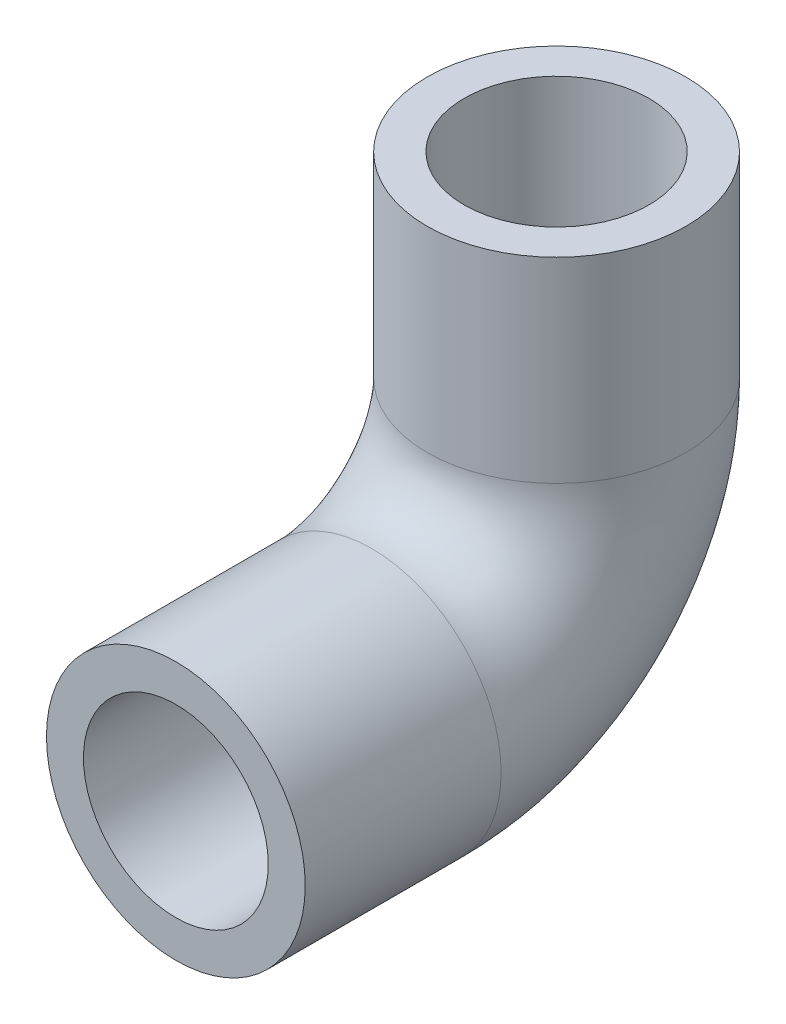
ISO-10303-21;
HEADER;
FILE_DESCRIPTION(('STEP AP214'),'2;1');
FILE_NAME('part.step','',(''),(''),'','','');
FILE_SCHEMA(('AUTOMOTIVE_DESIGN { 1 0 10303 214 1 1 1 1 }'));
ENDSEC;
DATA;
#1=APPLICATION_CONTEXT('core data for automotive mechanical design processes');
#2=APPLICATION_PROTOCOL_DEFINITION('international standard','automotive_design',2000,#1);
#3=PRODUCT_CONTEXT('',#1,'mechanical');
#4=PRODUCT('Part','Part','',(#3));
#5=PRODUCT_RELATED_PRODUCT_CATEGORY('part','',(#4));
#6=PRODUCT_DEFINITION_FORMATION('','',#4);
#7=PRODUCT_DEFINITION_CONTEXT('part definition',#1,'design');
#8=PRODUCT_DEFINITION('design','',#6,#7);
#9=PRODUCT_DEFINITION_SHAPE('','',#8);
#10=(LENGTH_UNIT() NAMED_UNIT(*) SI_UNIT(.MILLI.,.METRE.));
#11=(NAMED_UNIT(*) PLANE_ANGLE_UNIT() SI_UNIT($,.RADIAN.));
#12=(NAMED_UNIT(*) SI_UNIT($,.STERADIAN.) SOLID_ANGLE_UNIT());
#13=UNCERTAINTY_MEASURE_WITH_UNIT(LENGTH_MEASURE(1.E-05),#10,'distance_accuracy_value','');
#14=(GEOMETRIC_REPRESENTATION_CONTEXT(3) GLOBAL_UNCERTAINTY_ASSIGNED_CONTEXT((#13)) GLOBAL_UNIT_ASSIGNED_CONTEXT((#10,
#11,#12)) REPRESENTATION_CONTEXT('',''));
#15=CARTESIAN_POINT('',(0.,0.,0.));
#16=DIRECTION('',(0.,0.,1.));
#17=DIRECTION('',(1.,0.,0.));
#18=AXIS2_PLACEMENT_3D('',#15,#16,#17);
#19=CARTESIAN_POINT('',(0.,13.462,0.));
#20=DIRECTION('',(0.,1.,0.));
#21=DIRECTION('',(0.,0.,1.));
#22=AXIS2_PLACEMENT_3D('',#19,#20,#21);
#23=PLANE('',#22);
#24=CARTESIAN_POINT('',(0.,13.462,0.));
#25=DIRECTION('',(0.,1.,0.));
#26=DIRECTION('',(0.,0.,1.));
#27=AXIS2_PLACEMENT_3D('',#24,#25,#26);
#28=CIRCLE('',#27,8.89);
#29=CARTESIAN_POINT('',(0.,13.462,8.89));
#30=VERTEX_POINT('',#29);
#31=EDGE_CURVE('E10',#30,#30,#28,.T.);
#32=ORIENTED_EDGE('',*,*,#31,.T.);
#33=EDGE_LOOP('',(#32));
#34=FACE_BOUND('',#33,.T.);
#35=CARTESIAN_POINT('',(0.,13.462,0.));
#36=DIRECTION('',(0.,1.,0.));
#37=DIRECTION('',(0.,0.,1.));
#38=AXIS2_PLACEMENT_3D('',#35,#36,#37);
#39=CIRCLE('',#38,6.35);
#40=CARTESIAN_POINT('',(0.,13.462,6.35));
#41=VERTEX_POINT('',#40);
#42=EDGE_CURVE('E43',#41,#41,#39,.T.);
#43=ORIENTED_EDGE('',*,*,#42,.F.);
#44=EDGE_LOOP('',(#43));
#45=FACE_BOUND('',#44,.T.);
#46=ADVANCED_FACE('F35',(#34,#45),#23,.T.);
#47=CARTESIAN_POINT('',(0.,13.462,0.));
#48=DIRECTION('',(0.,-1.,0.));
#49=DIRECTION('',(0.,0.,-1.));
#50=AXIS2_PLACEMENT_3D('',#47,#48,#49);
#51=CYLINDRICAL_SURFACE('',#50,8.89);
#52=ORIENTED_EDGE('',*,*,#31,.F.);
#53=EDGE_LOOP('',(#52));
#54=FACE_BOUND('',#53,.T.);
#55=CARTESIAN_POINT('',(0.,0.,0.));
#56=DIRECTION('',(0.,-1.,0.));
#57=DIRECTION('',(0.,0.,-1.));
#58=AXIS2_PLACEMENT_3D('',#55,#56,#57);
#59=CIRCLE('',#58,8.89);
#60=CARTESIAN_POINT('',(0.,0.,-8.89));
#61=VERTEX_POINT('',#60);
#62=EDGE_CURVE('E55',#61,#61,#59,.T.);
#63=ORIENTED_EDGE('',*,*,#62,.F.);
#64=EDGE_LOOP('',(#63));
#65=FACE_BOUND('',#64,.T.);
#66=ADVANCED_FACE('F37',(#54,#65),#51,.T.);
#67=CARTESIAN_POINT('',(0.,13.462,0.));
#68=DIRECTION('',(0.,-1.,0.));
#69=DIRECTION('',(0.,0.,-1.));
#70=AXIS2_PLACEMENT_3D('',#67,#68,#69);
#71=CYLINDRICAL_SURFACE('',#70,6.35);
#72=ORIENTED_EDGE('',*,*,#42,.T.);
#73=EDGE_LOOP('',(#72));
#74=FACE_BOUND('',#73,.T.);
#75=CARTESIAN_POINT('',(0.,0.,0.));
#76=DIRECTION('',(0.,1.,0.));
#77=DIRECTION('',(0.,0.,1.));
#78=AXIS2_PLACEMENT_3D('',#75,#76,#77);
#79=CIRCLE('',#78,6.35);
#80=CARTESIAN_POINT('',(0.,0.,6.35));
#81=VERTEX_POINT('',#80);
#82=EDGE_CURVE('E48',#81,#81,#79,.T.);
#83=ORIENTED_EDGE('',*,*,#82,.F.);
#84=EDGE_LOOP('',(#83));
#85=FACE_BOUND('',#84,.T.);
#86=ADVANCED_FACE('F77',(#74,#85),#71,.F.);
#87=CARTESIAN_POINT('',(0.,0.,12.7));
#88=DIRECTION('',(-1.,0.,0.));
#89=DIRECTION('',(0.,0.,1.));
#90=AXIS2_PLACEMENT_3D('',#87,#88,#89);
#91=TOROIDAL_SURFACE('',#90,12.7,8.89);
#92=CARTESIAN_POINT('',(0.,-12.7,12.7));
#93=DIRECTION('',(0.,0.,1.));
#94=DIRECTION('',(0.,-1.,0.));
#95=AXIS2_PLACEMENT_3D('',#92,#93,#94);
#96=CIRCLE('',#95,8.89);
#97=CARTESIAN_POINT('',(0.,-21.59,12.7));
#98=VERTEX_POINT('',#97);
#99=EDGE_CURVE('E39',#98,#98,#96,.T.);
#100=CARTESIAN_POINT('',(0.,0.,12.7));
#101=DIRECTION('',(-1.,0.,0.));
#102=DIRECTION('',(0.,0.,1.));
#103=AXIS2_PLACEMENT_3D('',#100,#101,#102);
#104=CIRCLE('',#103,21.59);
#105=EDGE_CURVE('',#61,#98,#104,.T.);
#106=ORIENTED_EDGE('',*,*,#62,.T.);
#107=ORIENTED_EDGE('',*,*,#99,.F.);
#108=ORIENTED_EDGE('',*,*,#105,.T.);
#109=ORIENTED_EDGE('',*,*,#105,.F.);
#110=EDGE_LOOP('',(#106,#108,#107,#109));
#111=FACE_BOUND('',#110,.T.);
#112=ADVANCED_FACE('F76',(#111),#91,.T.);
#113=CARTESIAN_POINT('',(0.,0.,12.7));
#114=DIRECTION('',(-1.,0.,0.));
#115=DIRECTION('',(0.,0.,1.));
#116=AXIS2_PLACEMENT_3D('',#113,#114,#115);
#117=TOROIDAL_SURFACE('',#116,12.7,6.35);
#118=CARTESIAN_POINT('',(0.,-12.7,12.7));
#119=DIRECTION('',(0.,0.,-1.));
#120=DIRECTION('',(0.,-1.,0.));
#121=AXIS2_PLACEMENT_3D('',#118,#119,#120);
#122=CIRCLE('',#121,6.34932950692264);
#123=CARTESIAN_POINT('',(0.,-19.0493295069226,12.7));
#124=VERTEX_POINT('',#123);
#125=EDGE_CURVE('E54',#124,#124,#122,.T.);
#126=ORIENTED_EDGE('',*,*,#125,.F.);
#127=EDGE_LOOP('',(#126));
#128=FACE_BOUND('',#127,.T.);
#129=ORIENTED_EDGE('',*,*,#82,.T.);
#130=EDGE_LOOP('',(#129));
#131=FACE_BOUND('',#130,.T.);
#132=ADVANCED_FACE('F65',(#128,#131),#117,.F.);
#133=CARTESIAN_POINT('',(0.,-12.7,26.162));
#134=DIRECTION('',(0.,0.,1.));
#135=DIRECTION('',(1.,0.,0.));
#136=AXIS2_PLACEMENT_3D('',#133,#134,#135);
#137=PLANE('',#136);
#138=CARTESIAN_POINT('',(0.,-12.7,26.162));
#139=DIRECTION('',(0.,0.,1.));
#140=DIRECTION('',(1.,0.,0.));
#141=AXIS2_PLACEMENT_3D('',#138,#139,#140);
#142=CIRCLE('',#141,8.89);
#143=CARTESIAN_POINT('',(8.89,-12.7,26.162));
#144=VERTEX_POINT('',#143);
#145=EDGE_CURVE('E58',#144,#144,#142,.T.);
#146=ORIENTED_EDGE('',*,*,#145,.T.);
#147=EDGE_LOOP('',(#146));
#148=FACE_BOUND('',#147,.T.);
#149=CARTESIAN_POINT('',(0.,-12.7,26.162));
#150=DIRECTION('',(0.,0.,1.));
#151=DIRECTION('',(1.,0.,0.));
#152=AXIS2_PLACEMENT_3D('',#149,#150,#151);
#153=CIRCLE('',#152,6.34932950692264);
#154=CARTESIAN_POINT('',(6.34932950692264,-12.7,26.162));
#155=VERTEX_POINT('',#154);
#156=EDGE_CURVE('E166',#155,#155,#153,.T.);
#157=ORIENTED_EDGE('',*,*,#156,.F.);
#158=EDGE_LOOP('',(#157));
#159=FACE_BOUND('',#158,.T.);
#160=ADVANCED_FACE('F75',(#148,#159),#137,.T.);
#161=CARTESIAN_POINT('',(0.,-12.7,26.162));
#162=DIRECTION('',(0.,0.,-1.));
#163=DIRECTION('',(-1.,0.,0.));
#164=AXIS2_PLACEMENT_3D('',#161,#162,#163);
#165=CYLINDRICAL_SURFACE('',#164,8.89);
#166=ORIENTED_EDGE('',*,*,#145,.F.);
#167=EDGE_LOOP('',(#166));
#168=FACE_BOUND('',#167,.T.);
#169=ORIENTED_EDGE('',*,*,#99,.T.);
#170=EDGE_LOOP('',(#169));
#171=FACE_BOUND('',#170,.T.);
#172=ADVANCED_FACE('F78',(#168,#171),#165,.T.);
#173=CARTESIAN_POINT('',(0.,-12.7,26.162));
#174=DIRECTION('',(0.,0.,-1.));
#175=DIRECTION('',(-1.,0.,0.));
#176=AXIS2_PLACEMENT_3D('',#173,#174,#175);
#177=CYLINDRICAL_SURFACE('',#176,6.34932950692264);
#178=ORIENTED_EDGE('',*,*,#156,.T.);
#179=EDGE_LOOP('',(#178));
#180=FACE_BOUND('',#179,.T.);
#181=ORIENTED_EDGE('',*,*,#125,.T.);
#182=EDGE_LOOP('',(#181));
#183=FACE_BOUND('',#182,.T.);
#184=ADVANCED_FACE('F124',(#180,#183),#177,.F.);
#185=CLOSED_SHELL('',(#46,#66,#86,#112,#132,#160,#172,#184));
#186=MANIFOLD_SOLID_BREP('B2',#185);
#187=ADVANCED_BREP_SHAPE_REPRESENTATION('',(#18,#186),#14);
#188=SHAPE_DEFINITION_REPRESENTATION(#9,#187);
ENDSEC;
END-ISO-10303-21;
